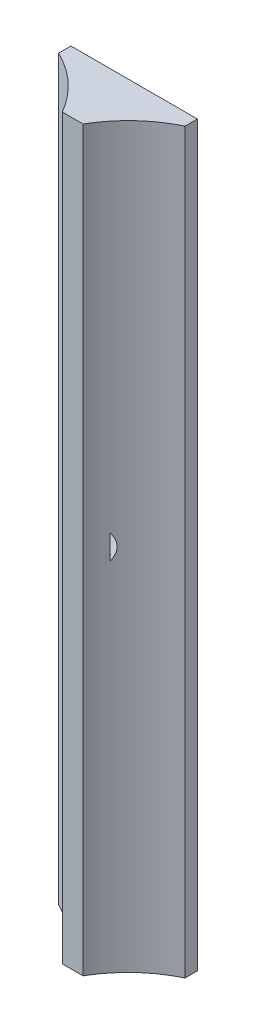
ISO-10303-21;
HEADER;
FILE_DESCRIPTION(('STEP AP214'),'2;1');
FILE_NAME('part.step','',(''),(''),'','','');
FILE_SCHEMA(('AUTOMOTIVE_DESIGN { 1 0 10303 214 1 1 1 1 }'));
ENDSEC;
DATA;
#1=APPLICATION_CONTEXT('core data for automotive mechanical design processes');
#2=APPLICATION_PROTOCOL_DEFINITION('international standard','automotive_design',2000,#1);
#3=PRODUCT_CONTEXT('',#1,'mechanical');
#4=PRODUCT('Part','Part','',(#3));
#5=PRODUCT_RELATED_PRODUCT_CATEGORY('part','',(#4));
#6=PRODUCT_DEFINITION_FORMATION('','',#4);
#7=PRODUCT_DEFINITION_CONTEXT('part definition',#1,'design');
#8=PRODUCT_DEFINITION('design','',#6,#7);
#9=PRODUCT_DEFINITION_SHAPE('','',#8);
#10=(LENGTH_UNIT() NAMED_UNIT(*) SI_UNIT(.MILLI.,.METRE.));
#11=(NAMED_UNIT(*) PLANE_ANGLE_UNIT() SI_UNIT($,.RADIAN.));
#12=(NAMED_UNIT(*) SI_UNIT($,.STERADIAN.) SOLID_ANGLE_UNIT());
#13=UNCERTAINTY_MEASURE_WITH_UNIT(LENGTH_MEASURE(1.E-05),#10,'distance_accuracy_value','');
#14=(GEOMETRIC_REPRESENTATION_CONTEXT(3) GLOBAL_UNCERTAINTY_ASSIGNED_CONTEXT((#13)) GLOBAL_UNIT_ASSIGNED_CONTEXT((#10,
#11,#12)) REPRESENTATION_CONTEXT('',''));
#15=CARTESIAN_POINT('',(0.,0.,0.));
#16=DIRECTION('',(0.,0.,1.));
#17=DIRECTION('',(1.,0.,0.));
#18=AXIS2_PLACEMENT_3D('',#15,#16,#17);
#19=CARTESIAN_POINT('',(-9.5,30.,5.));
#20=DIRECTION('',(0.,-1.,0.));
#21=DIRECTION('',(0.,0.,-1.));
#22=AXIS2_PLACEMENT_3D('',#19,#20,#21);
#23=CYLINDRICAL_SURFACE('',#22,10.);
#24=CARTESIAN_POINT('',(-1.73404867385843,-0.996531456949465,-1.3));
#25=CARTESIAN_POINT('',(-1.75189294484752,-0.96547810476221,-1.32199733314156));
#26=CARTESIAN_POINT('',(-1.76917289078421,-0.933479546005309,-1.34310615778721));
#27=CARTESIAN_POINT('',(-1.80240401304258,-0.867586088478633,-1.38339221234287));
#28=CARTESIAN_POINT('',(-1.81835398050708,-0.833689510317436,-1.40256768821451));
#29=CARTESIAN_POINT('',(-1.86401314860247,-0.728881594688414,-1.45708595357048));
#30=CARTESIAN_POINT('',(-1.89134835721475,-0.655163685441442,-1.48919651426405));
#31=CARTESIAN_POINT('',(-1.93786576064642,-0.501174663255252,-1.54334951198076));
#32=CARTESIAN_POINT('',(-1.95700370506095,-0.420870703501875,-1.56533735114542));
#33=CARTESIAN_POINT('',(-1.98523661482734,-0.256433076510698,-1.597636223871));
#34=CARTESIAN_POINT('',(-1.99436176740473,-0.172311721291725,-1.60798235802827));
#35=CARTESIAN_POINT('',(-2.00149858129135,-0.0097404639533099,-1.61607882778777));
#36=CARTESIAN_POINT('',(-2.00033670223577,0.0686281637244373,-1.6147658309113));
#37=CARTESIAN_POINT('',(-1.9889537270104,0.223879720909686,-1.60183729650491));
#38=CARTESIAN_POINT('',(-1.97872741626669,0.300761769202211,-1.59021582872913));
#39=CARTESIAN_POINT('',(-1.95058307759053,0.447920800843436,-1.55795207554073));
#40=CARTESIAN_POINT('',(-1.9329720796328,0.518337756995786,-1.53766933678646));
#41=CARTESIAN_POINT('',(-1.89127458470063,0.654324362153906,-1.48909199216199));
#42=CARTESIAN_POINT('',(-1.86718575497804,0.719892254084537,-1.46079449988306));
#43=CARTESIAN_POINT('',(-1.82444236338265,0.820432192612258,-1.40987061095733));
#44=CARTESIAN_POINT('',(-1.80740840682463,0.857245817671048,-1.38942990051796));
#45=CARTESIAN_POINT('',(-1.77181270661274,0.928580391287561,-1.34632993367226));
#46=CARTESIAN_POINT('',(-1.75325628731735,0.963108625992321,-1.32367836046466));
#47=CARTESIAN_POINT('',(-1.73404867385843,0.996531456949465,-1.3));
#48=B_SPLINE_CURVE_WITH_KNOTS('',3,(#24,#25,#26,#27,#28,#29,#30,#31,#32,#33,#34,#35,#36,#37,#38,
#39,#40,#41,#42,#43,#44,#45,#46,#47),.UNSPECIFIED.,.F.,.F.,(4,2,2,2,2,2,2,2,2,2,2,4),(0.,
0.12604936527894,0.252212079306059,0.505800882101442,0.760741862111459,1.01491209923433,
1.24885974721847,1.4829420676981,1.70812987005238,1.93339887419489,2.06954294200545,
2.20522967457363),.UNSPECIFIED.);
#49=CARTESIAN_POINT('',(-1.73404867385843,-0.996531456949465,-1.3));
#50=VERTEX_POINT('',#49);
#51=CARTESIAN_POINT('',(-1.73404867385843,0.996531456949465,-1.3));
#52=VERTEX_POINT('',#51);
#53=EDGE_CURVE('E164',#50,#52,#48,.T.);
#54=ORIENTED_EDGE('',*,*,#53,.T.);
#55=DIRECTION('',(0.,-1.,0.));
#56=VECTOR('',#55,1.);
#57=CARTESIAN_POINT('',(-1.73404867385843,30.,-1.3));
#58=LINE('',#57,#56);
#59=EDGE_CURVE('E49',#52,#50,#58,.T.);
#60=ORIENTED_EDGE('',*,*,#59,.T.);
#61=EDGE_LOOP('',(#54,#60));
#62=FACE_BOUND('',#61,.T.);
#63=CARTESIAN_POINT('',(-9.5,-30.,5.));
#64=DIRECTION('',(0.,-1.,0.));
#65=DIRECTION('',(0.,0.,-1.));
#66=AXIS2_PLACEMENT_3D('',#63,#64,#65);
#67=CIRCLE('',#66,10.);
#68=CARTESIAN_POINT('',(-5.14110105645933,-30.,-4.));
#69=VERTEX_POINT('',#68);
#70=CARTESIAN_POINT('',(-0.839745962155612,-30.,0.));
#71=VERTEX_POINT('',#70);
#72=EDGE_CURVE('E106',#69,#71,#67,.T.);
#73=ORIENTED_EDGE('',*,*,#72,.T.);
#74=DIRECTION('',(0.,-1.,0.));
#75=VECTOR('',#74,1.);
#76=CARTESIAN_POINT('',(-0.839745962155612,30.,0.));
#77=LINE('',#76,#75);
#78=CARTESIAN_POINT('',(-0.839745962155612,30.,0.));
#79=VERTEX_POINT('',#78);
#80=EDGE_CURVE('E161',#79,#71,#77,.T.);
#81=ORIENTED_EDGE('',*,*,#80,.F.);
#82=CARTESIAN_POINT('',(-9.5,30.,5.));
#83=DIRECTION('',(0.,-1.,0.));
#84=DIRECTION('',(0.,0.,-1.));
#85=AXIS2_PLACEMENT_3D('',#82,#83,#84);
#86=CIRCLE('',#85,10.);
#87=CARTESIAN_POINT('',(-5.14110105645933,30.,-4.));
#88=VERTEX_POINT('',#87);
#89=EDGE_CURVE('E151',#88,#79,#86,.T.);
#90=ORIENTED_EDGE('',*,*,#89,.F.);
#91=DIRECTION('',(0.,-1.,0.));
#92=VECTOR('',#91,1.);
#93=CARTESIAN_POINT('',(-5.14110105645933,30.,-4.));
#94=LINE('',#93,#92);
#95=EDGE_CURVE('E152',#88,#69,#94,.T.);
#96=ORIENTED_EDGE('',*,*,#95,.T.);
#97=EDGE_LOOP('',(#73,#81,#90,#96));
#98=FACE_BOUND('',#97,.T.);
#99=ADVANCED_FACE('F41',(#62,#98),#23,.F.);
#100=CARTESIAN_POINT('',(-0.839745962155612,30.,0.));
#101=DIRECTION('',(0.,0.,-1.));
#102=DIRECTION('',(-1.,0.,0.));
#103=AXIS2_PLACEMENT_3D('',#100,#101,#102);
#104=PLANE('',#103);
#105=DIRECTION('',(1.,0.,0.));
#106=VECTOR('',#105,1.);
#107=CARTESIAN_POINT('',(-0.839745962155612,-30.,0.));
#108=LINE('',#107,#106);
#109=CARTESIAN_POINT('',(0.839745962155612,-30.,0.));
#110=VERTEX_POINT('',#109);
#111=EDGE_CURVE('E132',#71,#110,#108,.T.);
#112=ORIENTED_EDGE('',*,*,#111,.T.);
#113=DIRECTION('',(0.,-1.,0.));
#114=VECTOR('',#113,1.);
#115=CARTESIAN_POINT('',(0.839745962155612,30.,0.));
#116=LINE('',#115,#114);
#117=CARTESIAN_POINT('',(0.839745962155612,30.,0.));
#118=VERTEX_POINT('',#117);
#119=EDGE_CURVE('E128',#118,#110,#116,.T.);
#120=ORIENTED_EDGE('',*,*,#119,.F.);
#121=DIRECTION('',(1.,0.,0.));
#122=VECTOR('',#121,1.);
#123=CARTESIAN_POINT('',(-0.839745962155612,30.,0.));
#124=LINE('',#123,#122);
#125=EDGE_CURVE('E203',#79,#118,#124,.T.);
#126=ORIENTED_EDGE('',*,*,#125,.F.);
#127=ORIENTED_EDGE('',*,*,#80,.T.);
#128=EDGE_LOOP('',(#112,#120,#126,#127));
#129=FACE_BOUND('',#128,.T.);
#130=ADVANCED_FACE('F117',(#129),#104,.F.);
#131=CARTESIAN_POINT('',(9.5,30.,5.));
#132=DIRECTION('',(0.,-1.,0.));
#133=DIRECTION('',(0.,0.,-1.));
#134=AXIS2_PLACEMENT_3D('',#131,#132,#133);
#135=CYLINDRICAL_SURFACE('',#134,10.);
#136=CARTESIAN_POINT('',(1.73404867385843,0.996531456949465,-1.3));
#137=CARTESIAN_POINT('',(1.75189294484752,0.96547810476221,-1.32199733314156));
#138=CARTESIAN_POINT('',(1.76917289078421,0.933479546005309,-1.34310615778721));
#139=CARTESIAN_POINT('',(1.80240401304258,0.867586088478633,-1.38339221234287));
#140=CARTESIAN_POINT('',(1.81835398050708,0.833689510317436,-1.40256768821451));
#141=CARTESIAN_POINT('',(1.86401314860247,0.728881594688414,-1.45708595357048));
#142=CARTESIAN_POINT('',(1.89134835721475,0.655163685441442,-1.48919651426405));
#143=CARTESIAN_POINT('',(1.93786576064642,0.501174663255252,-1.54334951198076));
#144=CARTESIAN_POINT('',(1.95700370506095,0.420870703501875,-1.56533735114542));
#145=CARTESIAN_POINT('',(1.98523661482734,0.256433076510698,-1.597636223871));
#146=CARTESIAN_POINT('',(1.99436176740473,0.172311721291725,-1.60798235802827));
#147=CARTESIAN_POINT('',(2.00149858129135,0.0097404639533099,-1.61607882778777));
#148=CARTESIAN_POINT('',(2.00033670223577,-0.0686281637244373,-1.6147658309113));
#149=CARTESIAN_POINT('',(1.9889537270104,-0.223879720909686,-1.60183729650491));
#150=CARTESIAN_POINT('',(1.97872741626669,-0.300761769202211,-1.59021582872913));
#151=CARTESIAN_POINT('',(1.95058307759053,-0.447920800843436,-1.55795207554073));
#152=CARTESIAN_POINT('',(1.9329720796328,-0.518337756995786,-1.53766933678646));
#153=CARTESIAN_POINT('',(1.89127458470063,-0.654324362153906,-1.48909199216199));
#154=CARTESIAN_POINT('',(1.86718575497804,-0.719892254084537,-1.46079449988306));
#155=CARTESIAN_POINT('',(1.82444236338265,-0.820432192612258,-1.40987061095733));
#156=CARTESIAN_POINT('',(1.80740840682463,-0.857245817671048,-1.38942990051796));
#157=CARTESIAN_POINT('',(1.77181270661274,-0.928580391287561,-1.34632993367226));
#158=CARTESIAN_POINT('',(1.75325628731735,-0.963108625992321,-1.32367836046466));
#159=CARTESIAN_POINT('',(1.73404867385843,-0.996531456949465,-1.3));
#160=B_SPLINE_CURVE_WITH_KNOTS('',3,(#136,#137,#138,#139,#140,#141,#142,#143,#144,#145,#146,
#147,#148,#149,#150,#151,#152,#153,#154,#155,#156,#157,#158,#159),.UNSPECIFIED.,.F.,.F.,(4,2,2,
2,2,2,2,2,2,2,2,4),(0.,0.12604936527894,0.252212079306059,0.505800882101442,0.760741862111459,
1.01491209923433,1.24885974721847,1.4829420676981,1.70812987005238,1.93339887419489,
2.06954294200545,2.20522967457363),.UNSPECIFIED.);
#161=CARTESIAN_POINT('',(1.73404867385843,0.996531456949465,-1.3));
#162=VERTEX_POINT('',#161);
#163=CARTESIAN_POINT('',(1.73404867385843,-0.996531456949465,-1.3));
#164=VERTEX_POINT('',#163);
#165=EDGE_CURVE('E103',#162,#164,#160,.T.);
#166=ORIENTED_EDGE('',*,*,#165,.T.);
#167=DIRECTION('',(0.,-1.,0.));
#168=VECTOR('',#167,1.);
#169=CARTESIAN_POINT('',(1.73404867385843,30.,-1.3));
#170=LINE('',#169,#168);
#171=EDGE_CURVE('E11',#164,#162,#170,.F.);
#172=ORIENTED_EDGE('',*,*,#171,.T.);
#173=EDGE_LOOP('',(#166,#172));
#174=FACE_BOUND('',#173,.T.);
#175=CARTESIAN_POINT('',(9.5,-30.,5.));
#176=DIRECTION('',(0.,-1.,0.));
#177=DIRECTION('',(0.,0.,-1.));
#178=AXIS2_PLACEMENT_3D('',#175,#176,#177);
#179=CIRCLE('',#178,10.);
#180=CARTESIAN_POINT('',(5.14110105645933,-30.,-4.));
#181=VERTEX_POINT('',#180);
#182=EDGE_CURVE('E122',#110,#181,#179,.T.);
#183=ORIENTED_EDGE('',*,*,#182,.T.);
#184=DIRECTION('',(0.,-1.,0.));
#185=VECTOR('',#184,1.);
#186=CARTESIAN_POINT('',(5.14110105645933,30.,-4.));
#187=LINE('',#186,#185);
#188=CARTESIAN_POINT('',(5.14110105645933,30.,-4.));
#189=VERTEX_POINT('',#188);
#190=EDGE_CURVE('E125',#189,#181,#187,.T.);
#191=ORIENTED_EDGE('',*,*,#190,.F.);
#192=CARTESIAN_POINT('',(9.5,30.,5.));
#193=DIRECTION('',(0.,-1.,0.));
#194=DIRECTION('',(0.,0.,-1.));
#195=AXIS2_PLACEMENT_3D('',#192,#193,#194);
#196=CIRCLE('',#195,10.);
#197=EDGE_CURVE('E202',#118,#189,#196,.T.);
#198=ORIENTED_EDGE('',*,*,#197,.F.);
#199=ORIENTED_EDGE('',*,*,#119,.T.);
#200=EDGE_LOOP('',(#183,#191,#198,#199));
#201=FACE_BOUND('',#200,.T.);
#202=ADVANCED_FACE('F113',(#174,#201),#135,.F.);
#203=CARTESIAN_POINT('',(5.14110105645933,30.,-4.));
#204=DIRECTION('',(-1.,0.,0.));
#205=DIRECTION('',(0.,0.,1.));
#206=AXIS2_PLACEMENT_3D('',#203,#204,#205);
#207=PLANE('',#206);
#208=DIRECTION('',(0.,0.,-1.));
#209=VECTOR('',#208,1.);
#210=CARTESIAN_POINT('',(5.14110105645933,-30.,-4.));
#211=LINE('',#210,#209);
#212=CARTESIAN_POINT('',(5.14110105645933,-30.,-5.));
#213=VERTEX_POINT('',#212);
#214=EDGE_CURVE('E131',#181,#213,#211,.T.);
#215=ORIENTED_EDGE('',*,*,#214,.T.);
#216=DIRECTION('',(0.,-1.,0.));
#217=VECTOR('',#216,1.);
#218=CARTESIAN_POINT('',(5.14110105645933,30.,-5.));
#219=LINE('',#218,#217);
#220=CARTESIAN_POINT('',(5.14110105645933,30.,-5.));
#221=VERTEX_POINT('',#220);
#222=EDGE_CURVE('E138',#221,#213,#219,.T.);
#223=ORIENTED_EDGE('',*,*,#222,.F.);
#224=DIRECTION('',(0.,0.,-1.));
#225=VECTOR('',#224,1.);
#226=CARTESIAN_POINT('',(5.14110105645933,30.,-4.));
#227=LINE('',#226,#225);
#228=EDGE_CURVE('E137',#189,#221,#227,.T.);
#229=ORIENTED_EDGE('',*,*,#228,.F.);
#230=ORIENTED_EDGE('',*,*,#190,.T.);
#231=EDGE_LOOP('',(#215,#223,#229,#230));
#232=FACE_BOUND('',#231,.T.);
#233=ADVANCED_FACE('F116',(#232),#207,.F.);
#234=CARTESIAN_POINT('',(5.14110105645933,30.,-5.));
#235=DIRECTION('',(0.,0.,1.));
#236=DIRECTION('',(1.,0.,0.));
#237=AXIS2_PLACEMENT_3D('',#234,#235,#236);
#238=PLANE('',#237);
#239=CARTESIAN_POINT('',(0.,0.,-5.));
#240=DIRECTION('',(0.,0.,-1.));
#241=DIRECTION('',(-1.,0.,0.));
#242=AXIS2_PLACEMENT_3D('',#239,#240,#241);
#243=CIRCLE('',#242,2.200000045);
#244=CARTESIAN_POINT('',(-2.200000045,0.,-5.));
#245=VERTEX_POINT('',#244);
#246=EDGE_CURVE('E300',#245,#245,#243,.T.);
#247=ORIENTED_EDGE('',*,*,#246,.F.);
#248=EDGE_LOOP('',(#247));
#249=FACE_BOUND('',#248,.T.);
#250=DIRECTION('',(-1.,0.,0.));
#251=VECTOR('',#250,1.);
#252=CARTESIAN_POINT('',(5.14110105645933,-30.,-5.));
#253=LINE('',#252,#251);
#254=CARTESIAN_POINT('',(-5.14110105645933,-30.,-5.));
#255=VERTEX_POINT('',#254);
#256=EDGE_CURVE('E144',#213,#255,#253,.T.);
#257=ORIENTED_EDGE('',*,*,#256,.T.);
#258=DIRECTION('',(0.,-1.,0.));
#259=VECTOR('',#258,1.);
#260=CARTESIAN_POINT('',(-5.14110105645933,30.,-5.));
#261=LINE('',#260,#259);
#262=CARTESIAN_POINT('',(-5.14110105645933,30.,-5.));
#263=VERTEX_POINT('',#262);
#264=EDGE_CURVE('E155',#263,#255,#261,.T.);
#265=ORIENTED_EDGE('',*,*,#264,.F.);
#266=DIRECTION('',(-1.,0.,0.));
#267=VECTOR('',#266,1.);
#268=CARTESIAN_POINT('',(5.14110105645933,30.,-5.));
#269=LINE('',#268,#267);
#270=EDGE_CURVE('E199',#221,#263,#269,.T.);
#271=ORIENTED_EDGE('',*,*,#270,.F.);
#272=ORIENTED_EDGE('',*,*,#222,.T.);
#273=EDGE_LOOP('',(#257,#265,#271,#272));
#274=FACE_BOUND('',#273,.T.);
#275=ADVANCED_FACE('F216',(#249,#274),#238,.F.);
#276=CARTESIAN_POINT('',(-5.14110105645933,30.,-5.));
#277=DIRECTION('',(1.,0.,0.));
#278=DIRECTION('',(0.,0.,-1.));
#279=AXIS2_PLACEMENT_3D('',#276,#277,#278);
#280=PLANE('',#279);
#281=DIRECTION('',(0.,0.,1.));
#282=VECTOR('',#281,1.);
#283=CARTESIAN_POINT('',(-5.14110105645933,-30.,-5.));
#284=LINE('',#283,#282);
#285=EDGE_CURVE('E146',#255,#69,#284,.T.);
#286=ORIENTED_EDGE('',*,*,#285,.T.);
#287=ORIENTED_EDGE('',*,*,#95,.F.);
#288=DIRECTION('',(0.,0.,1.));
#289=VECTOR('',#288,1.);
#290=CARTESIAN_POINT('',(-5.14110105645933,30.,-5.));
#291=LINE('',#290,#289);
#292=EDGE_CURVE('E156',#263,#88,#291,.T.);
#293=ORIENTED_EDGE('',*,*,#292,.F.);
#294=ORIENTED_EDGE('',*,*,#264,.T.);
#295=EDGE_LOOP('',(#286,#287,#293,#294));
#296=FACE_BOUND('',#295,.T.);
#297=ADVANCED_FACE('F212',(#296),#280,.F.);
#298=CARTESIAN_POINT('',(-9.5,30.,5.));
#299=DIRECTION('',(0.,-1.,0.));
#300=DIRECTION('',(0.,0.,-1.));
#301=AXIS2_PLACEMENT_3D('',#298,#299,#300);
#302=PLANE('',#301);
#303=ORIENTED_EDGE('',*,*,#89,.T.);
#304=ORIENTED_EDGE('',*,*,#125,.T.);
#305=ORIENTED_EDGE('',*,*,#197,.T.);
#306=ORIENTED_EDGE('',*,*,#228,.T.);
#307=ORIENTED_EDGE('',*,*,#270,.T.);
#308=ORIENTED_EDGE('',*,*,#292,.T.);
#309=EDGE_LOOP('',(#303,#304,#305,#306,#307,#308));
#310=FACE_BOUND('',#309,.T.);
#311=ADVANCED_FACE('F207',(#310),#302,.F.);
#312=CARTESIAN_POINT('',(-9.5,-30.,5.));
#313=DIRECTION('',(0.,-1.,0.));
#314=DIRECTION('',(0.,0.,-1.));
#315=AXIS2_PLACEMENT_3D('',#312,#313,#314);
#316=PLANE('',#315);
#317=ORIENTED_EDGE('',*,*,#72,.F.);
#318=ORIENTED_EDGE('',*,*,#285,.F.);
#319=ORIENTED_EDGE('',*,*,#256,.F.);
#320=ORIENTED_EDGE('',*,*,#214,.F.);
#321=ORIENTED_EDGE('',*,*,#182,.F.);
#322=ORIENTED_EDGE('',*,*,#111,.F.);
#323=EDGE_LOOP('',(#317,#318,#319,#320,#321,#322));
#324=FACE_BOUND('',#323,.T.);
#325=ADVANCED_FACE('F142',(#324),#316,.T.);
#326=CARTESIAN_POINT('',(0.,0.,-1.3));
#327=DIRECTION('',(0.,0.,1.));
#328=DIRECTION('',(1.,0.,0.));
#329=AXIS2_PLACEMENT_3D('',#326,#327,#328);
#330=PLANE('',#329);
#331=CARTESIAN_POINT('',(0.,0.,-1.3));
#332=DIRECTION('',(0.,0.,-1.));
#333=DIRECTION('',(-1.,0.,0.));
#334=AXIS2_PLACEMENT_3D('',#331,#332,#333);
#335=CIRCLE('',#334,1.999999937);
#336=EDGE_CURVE('E61',#52,#162,#335,.T.);
#337=ORIENTED_EDGE('',*,*,#336,.T.);
#338=ORIENTED_EDGE('',*,*,#171,.F.);
#339=EDGE_CURVE('E56',#164,#50,#335,.T.);
#340=ORIENTED_EDGE('',*,*,#339,.T.);
#341=ORIENTED_EDGE('',*,*,#59,.F.);
#342=EDGE_LOOP('',(#337,#338,#340,#341));
#343=FACE_BOUND('',#342,.T.);
#344=ADVANCED_FACE('F109',(#343),#330,.F.);
#345=CARTESIAN_POINT('',(0.,0.,-5.));
#346=DIRECTION('',(0.,0.,-1.));
#347=DIRECTION('',(-1.,0.,0.));
#348=AXIS2_PLACEMENT_3D('',#345,#346,#347);
#349=CYLINDRICAL_SURFACE('',#348,1.999999937);
#350=CARTESIAN_POINT('',(0.,0.,-2.13986520418565));
#351=DIRECTION('',(0.,0.,-1.));
#352=DIRECTION('',(-1.,0.,0.));
#353=AXIS2_PLACEMENT_3D('',#350,#351,#352);
#354=CIRCLE('',#353,1.999999937);
#355=CARTESIAN_POINT('',(-1.999999937,0.,-2.13986520418565));
#356=VERTEX_POINT('',#355);
#357=EDGE_CURVE('E298',#356,#356,#354,.T.);
#358=ORIENTED_EDGE('',*,*,#357,.T.);
#359=EDGE_LOOP('',(#358));
#360=FACE_BOUND('',#359,.T.);
#361=ORIENTED_EDGE('',*,*,#336,.F.);
#362=ORIENTED_EDGE('',*,*,#53,.F.);
#363=ORIENTED_EDGE('',*,*,#339,.F.);
#364=ORIENTED_EDGE('',*,*,#165,.F.);
#365=EDGE_LOOP('',(#361,#362,#363,#364));
#366=FACE_BOUND('',#365,.T.);
#367=ADVANCED_FACE('F104',(#360,#366),#349,.F.);
#368=CARTESIAN_POINT('',(0.,0.,-5.));
#369=DIRECTION('',(0.,0.,-1.));
#370=DIRECTION('',(-1.,0.,0.));
#371=AXIS2_PLACEMENT_3D('',#368,#369,#370);
#372=CONICAL_SURFACE('',#371,2.200000045,0.0698131700797729);
#373=ORIENTED_EDGE('',*,*,#357,.F.);
#374=EDGE_LOOP('',(#373));
#375=FACE_BOUND('',#374,.T.);
#376=ORIENTED_EDGE('',*,*,#246,.T.);
#377=EDGE_LOOP('',(#376));
#378=FACE_BOUND('',#377,.T.);
#379=ADVANCED_FACE('F174',(#375,#378),#372,.F.);
#380=CLOSED_SHELL('',(#99,#130,#202,#233,#275,#297,#311,#325,#344,#367,#379));
#381=MANIFOLD_SOLID_BREP('B2',#380);
#382=ADVANCED_BREP_SHAPE_REPRESENTATION('',(#18,#381),#14);
#383=SHAPE_DEFINITION_REPRESENTATION(#9,#382);
ENDSEC;
END-ISO-10303-21;
